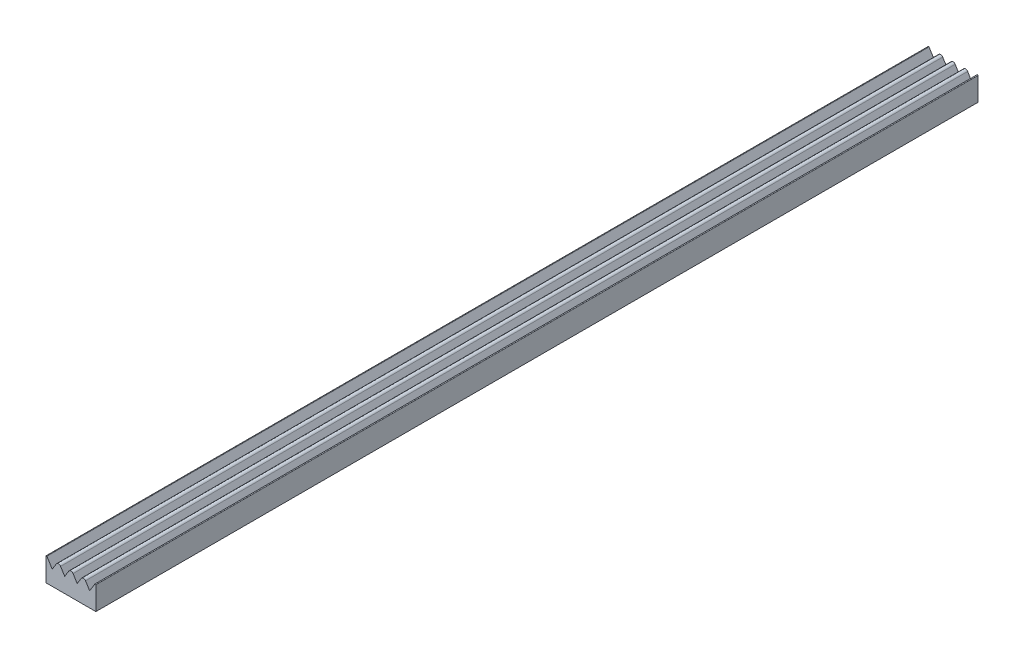
ISO-10303-21;
HEADER;
FILE_DESCRIPTION(('STEP AP214'),'2;1');
FILE_NAME('part.step','',(''),(''),'','','');
FILE_SCHEMA(('AUTOMOTIVE_DESIGN { 1 0 10303 214 1 1 1 1 }'));
ENDSEC;
DATA;
#1=APPLICATION_CONTEXT('core data for automotive mechanical design processes');
#2=APPLICATION_PROTOCOL_DEFINITION('international standard','automotive_design',2000,#1);
#3=PRODUCT_CONTEXT('',#1,'mechanical');
#4=PRODUCT('Part','Part','',(#3));
#5=PRODUCT_RELATED_PRODUCT_CATEGORY('part','',(#4));
#6=PRODUCT_DEFINITION_FORMATION('','',#4);
#7=PRODUCT_DEFINITION_CONTEXT('part definition',#1,'design');
#8=PRODUCT_DEFINITION('design','',#6,#7);
#9=PRODUCT_DEFINITION_SHAPE('','',#8);
#10=(LENGTH_UNIT() NAMED_UNIT(*) SI_UNIT(.MILLI.,.METRE.));
#11=(NAMED_UNIT(*) PLANE_ANGLE_UNIT() SI_UNIT($,.RADIAN.));
#12=(NAMED_UNIT(*) SI_UNIT($,.STERADIAN.) SOLID_ANGLE_UNIT());
#13=UNCERTAINTY_MEASURE_WITH_UNIT(LENGTH_MEASURE(1.E-05),#10,'distance_accuracy_value','');
#14=(GEOMETRIC_REPRESENTATION_CONTEXT(3) GLOBAL_UNCERTAINTY_ASSIGNED_CONTEXT((#13)) GLOBAL_UNIT_ASSIGNED_CONTEXT((#10,
#11,#12)) REPRESENTATION_CONTEXT('',''));
#15=CARTESIAN_POINT('',(0.,0.,0.));
#16=DIRECTION('',(0.,0.,1.));
#17=DIRECTION('',(1.,0.,0.));
#18=AXIS2_PLACEMENT_3D('',#15,#16,#17);
#19=CARTESIAN_POINT('',(0.,0.,224.63125));
#20=DIRECTION('',(-1.,0.,0.));
#21=DIRECTION('',(0.,0.,1.));
#22=AXIS2_PLACEMENT_3D('',#19,#20,#21);
#23=PLANE('',#22);
#24=DIRECTION('',(0.,1.,0.));
#25=VECTOR('',#24,1.);
#26=CARTESIAN_POINT('',(0.,0.,0.));
#27=LINE('',#26,#25);
#28=CARTESIAN_POINT('',(0.,0.,0.));
#29=VERTEX_POINT('',#28);
#30=CARTESIAN_POINT('',(0.,5.90717687924576,0.));
#31=VERTEX_POINT('',#30);
#32=EDGE_CURVE('E177',#29,#31,#27,.T.);
#33=ORIENTED_EDGE('',*,*,#32,.T.);
#34=DIRECTION('',(0.,0.,-1.));
#35=VECTOR('',#34,1.);
#36=CARTESIAN_POINT('',(0.,5.90717687924576,224.63125));
#37=LINE('',#36,#35);
#38=CARTESIAN_POINT('',(0.,5.90717687924576,224.63125));
#39=VERTEX_POINT('',#38);
#40=EDGE_CURVE('E11',#39,#31,#37,.T.);
#41=ORIENTED_EDGE('',*,*,#40,.F.);
#42=DIRECTION('',(0.,1.,0.));
#43=VECTOR('',#42,1.);
#44=CARTESIAN_POINT('',(0.,0.,224.63125));
#45=LINE('',#44,#43);
#46=CARTESIAN_POINT('',(0.,0.,224.63125));
#47=VERTEX_POINT('',#46);
#48=EDGE_CURVE('E207',#47,#39,#45,.T.);
#49=ORIENTED_EDGE('',*,*,#48,.F.);
#50=DIRECTION('',(0.,0.,-1.));
#51=VECTOR('',#50,1.);
#52=CARTESIAN_POINT('',(0.,0.,224.63125));
#53=LINE('',#52,#51);
#54=EDGE_CURVE('E173',#47,#29,#53,.T.);
#55=ORIENTED_EDGE('',*,*,#54,.T.);
#56=EDGE_LOOP('',(#33,#41,#49,#55));
#57=FACE_BOUND('',#56,.T.);
#58=ADVANCED_FACE('F33',(#57),#23,.F.);
#59=CARTESIAN_POINT('',(-0.127,5.90717687924576,224.63125));
#60=DIRECTION('',(0.,0.,-1.));
#61=DIRECTION('',(-1.,0.,0.));
#62=AXIS2_PLACEMENT_3D('',#59,#60,#61);
#63=CYLINDRICAL_SURFACE('',#62,0.127);
#64=CARTESIAN_POINT('',(-0.127,5.90717687924576,0.));
#65=DIRECTION('',(0.,0.,1.));
#66=DIRECTION('',(1.,0.,0.));
#67=AXIS2_PLACEMENT_3D('',#64,#65,#66);
#68=CIRCLE('',#67,0.127);
#69=CARTESIAN_POINT('',(-0.234695784608649,5.97448674462616,0.));
#70=VERTEX_POINT('',#69);
#71=EDGE_CURVE('E180',#31,#70,#68,.T.);
#72=ORIENTED_EDGE('',*,*,#71,.T.);
#73=DIRECTION('',(0.,0.,-1.));
#74=VECTOR('',#73,1.);
#75=CARTESIAN_POINT('',(-0.234695784608649,5.97448674462616,224.63125));
#76=LINE('',#75,#74);
#77=CARTESIAN_POINT('',(-0.234695784608649,5.97448674462616,224.63125));
#78=VERTEX_POINT('',#77);
#79=EDGE_CURVE('E41',#78,#70,#76,.T.);
#80=ORIENTED_EDGE('',*,*,#79,.F.);
#81=CARTESIAN_POINT('',(-0.127,5.90717687924576,224.63125));
#82=DIRECTION('',(0.,0.,1.));
#83=DIRECTION('',(1.,0.,0.));
#84=AXIS2_PLACEMENT_3D('',#81,#82,#83);
#85=CIRCLE('',#84,0.127);
#86=EDGE_CURVE('E116',#39,#78,#85,.T.);
#87=ORIENTED_EDGE('',*,*,#86,.F.);
#88=ORIENTED_EDGE('',*,*,#40,.T.);
#89=EDGE_LOOP('',(#72,#80,#87,#88));
#90=FACE_BOUND('',#89,.T.);
#91=ADVANCED_FACE('F305',(#90),#63,.T.);
#92=CARTESIAN_POINT('',(-1.5875,3.81,224.63125));
#93=DIRECTION('',(0.847998304005088,-0.529998940003179,0.));
#94=DIRECTION('',(0.529998940003179,0.847998304005088,0.));
#95=AXIS2_PLACEMENT_3D('',#92,#93,#94);
#96=PLANE('',#95);
#97=DIRECTION('',(-0.529998940003179,-0.847998304005088,0.));
#98=VECTOR('',#97,1.);
#99=CARTESIAN_POINT('',(-1.5875,3.81,0.));
#100=LINE('',#99,#98);
#101=CARTESIAN_POINT('',(-1.5875,3.81,0.));
#102=VERTEX_POINT('',#101);
#103=EDGE_CURVE('E182',#70,#102,#100,.T.);
#104=ORIENTED_EDGE('',*,*,#103,.T.);
#105=DIRECTION('',(0.,0.,-1.));
#106=VECTOR('',#105,1.);
#107=CARTESIAN_POINT('',(-1.5875,3.81,224.63125));
#108=LINE('',#107,#106);
#109=CARTESIAN_POINT('',(-1.5875,3.81,224.63125));
#110=VERTEX_POINT('',#109);
#111=EDGE_CURVE('E238',#110,#102,#108,.T.);
#112=ORIENTED_EDGE('',*,*,#111,.F.);
#113=DIRECTION('',(-0.529998940003179,-0.847998304005088,0.));
#114=VECTOR('',#113,1.);
#115=CARTESIAN_POINT('',(-1.5875,3.81,224.63125));
#116=LINE('',#115,#114);
#117=EDGE_CURVE('E246',#78,#110,#116,.T.);
#118=ORIENTED_EDGE('',*,*,#117,.F.);
#119=ORIENTED_EDGE('',*,*,#79,.T.);
#120=EDGE_LOOP('',(#104,#112,#118,#119));
#121=FACE_BOUND('',#120,.T.);
#122=ADVANCED_FACE('F244',(#121),#96,.F.);
#123=CARTESIAN_POINT('',(-2.63652107695677,5.48843372313082,224.63125));
#124=DIRECTION('',(-0.847998304005088,-0.52999894000318,0.));
#125=DIRECTION('',(0.52999894000318,-0.847998304005088,0.));
#126=AXIS2_PLACEMENT_3D('',#123,#124,#125);
#127=PLANE('',#126);
#128=DIRECTION('',(-0.52999894000318,0.847998304005088,0.));
#129=VECTOR('',#128,1.);
#130=CARTESIAN_POINT('',(-2.63652107695677,5.48843372313082,0.));
#131=LINE('',#130,#129);
#132=CARTESIAN_POINT('',(-2.63652107695677,5.48843372313082,0.));
#133=VERTEX_POINT('',#132);
#134=EDGE_CURVE('E184',#102,#133,#131,.T.);
#135=ORIENTED_EDGE('',*,*,#134,.T.);
#136=DIRECTION('',(0.,0.,-1.));
#137=VECTOR('',#136,1.);
#138=CARTESIAN_POINT('',(-2.63652107695677,5.48843372313082,224.63125));
#139=LINE('',#138,#137);
#140=CARTESIAN_POINT('',(-2.63652107695677,5.48843372313082,224.63125));
#141=VERTEX_POINT('',#140);
#142=EDGE_CURVE('E235',#141,#133,#139,.T.);
#143=ORIENTED_EDGE('',*,*,#142,.F.);
#144=DIRECTION('',(-0.52999894000318,0.847998304005088,0.));
#145=VECTOR('',#144,1.);
#146=CARTESIAN_POINT('',(-2.63652107695677,5.48843372313082,224.63125));
#147=LINE('',#146,#145);
#148=EDGE_CURVE('E264',#110,#141,#147,.T.);
#149=ORIENTED_EDGE('',*,*,#148,.F.);
#150=ORIENTED_EDGE('',*,*,#111,.T.);
#151=EDGE_LOOP('',(#135,#143,#149,#150));
#152=FACE_BOUND('',#151,.T.);
#153=ADVANCED_FACE('F255',(#152),#127,.F.);
#154=CARTESIAN_POINT('',(-3.175,5.15188439622881,224.63125));
#155=DIRECTION('',(0.,0.,-1.));
#156=DIRECTION('',(-1.,0.,0.));
#157=AXIS2_PLACEMENT_3D('',#154,#155,#156);
#158=CYLINDRICAL_SURFACE('',#157,0.635);
#159=CARTESIAN_POINT('',(-3.175,5.15188439622881,0.));
#160=DIRECTION('',(0.,0.,1.));
#161=DIRECTION('',(-1.,0.,0.));
#162=AXIS2_PLACEMENT_3D('',#159,#160,#161);
#163=CIRCLE('',#162,0.635);
#164=CARTESIAN_POINT('',(-3.71347892304324,5.48843372313082,0.));
#165=VERTEX_POINT('',#164);
#166=EDGE_CURVE('E186',#133,#165,#163,.T.);
#167=ORIENTED_EDGE('',*,*,#166,.T.);
#168=DIRECTION('',(0.,0.,-1.));
#169=VECTOR('',#168,1.);
#170=CARTESIAN_POINT('',(-3.71347892304324,5.48843372313082,224.63125));
#171=LINE('',#170,#169);
#172=CARTESIAN_POINT('',(-3.71347892304324,5.48843372313082,224.63125));
#173=VERTEX_POINT('',#172);
#174=EDGE_CURVE('E232',#173,#165,#171,.T.);
#175=ORIENTED_EDGE('',*,*,#174,.F.);
#176=CARTESIAN_POINT('',(-3.175,5.15188439622881,224.63125));
#177=DIRECTION('',(0.,0.,1.));
#178=DIRECTION('',(-1.,0.,0.));
#179=AXIS2_PLACEMENT_3D('',#176,#177,#178);
#180=CIRCLE('',#179,0.635);
#181=EDGE_CURVE('E261',#141,#173,#180,.T.);
#182=ORIENTED_EDGE('',*,*,#181,.F.);
#183=ORIENTED_EDGE('',*,*,#142,.T.);
#184=EDGE_LOOP('',(#167,#175,#182,#183));
#185=FACE_BOUND('',#184,.T.);
#186=ADVANCED_FACE('F259',(#185),#158,.T.);
#187=CARTESIAN_POINT('',(-4.7625,3.81,224.63125));
#188=DIRECTION('',(0.847998304005088,-0.52999894000318,0.));
#189=DIRECTION('',(0.52999894000318,0.847998304005088,0.));
#190=AXIS2_PLACEMENT_3D('',#187,#188,#189);
#191=PLANE('',#190);
#192=DIRECTION('',(-0.52999894000318,-0.847998304005088,0.));
#193=VECTOR('',#192,1.);
#194=CARTESIAN_POINT('',(-4.7625,3.81,0.));
#195=LINE('',#194,#193);
#196=CARTESIAN_POINT('',(-4.7625,3.81,0.));
#197=VERTEX_POINT('',#196);
#198=EDGE_CURVE('E188',#165,#197,#195,.T.);
#199=ORIENTED_EDGE('',*,*,#198,.T.);
#200=DIRECTION('',(0.,0.,-1.));
#201=VECTOR('',#200,1.);
#202=CARTESIAN_POINT('',(-4.7625,3.81,224.63125));
#203=LINE('',#202,#201);
#204=CARTESIAN_POINT('',(-4.7625,3.81,224.63125));
#205=VERTEX_POINT('',#204);
#206=EDGE_CURVE('E229',#205,#197,#203,.T.);
#207=ORIENTED_EDGE('',*,*,#206,.F.);
#208=DIRECTION('',(-0.52999894000318,-0.847998304005088,0.));
#209=VECTOR('',#208,1.);
#210=CARTESIAN_POINT('',(-4.7625,3.81,224.63125));
#211=LINE('',#210,#209);
#212=EDGE_CURVE('E263',#173,#205,#211,.T.);
#213=ORIENTED_EDGE('',*,*,#212,.F.);
#214=ORIENTED_EDGE('',*,*,#174,.T.);
#215=EDGE_LOOP('',(#199,#207,#213,#214));
#216=FACE_BOUND('',#215,.T.);
#217=ADVANCED_FACE('F318',(#216),#191,.F.);
#218=CARTESIAN_POINT('',(-4.7625,3.81,224.63125));
#219=DIRECTION('',(-0.847998304005088,-0.52999894000318,0.));
#220=DIRECTION('',(0.52999894000318,-0.847998304005088,0.));
#221=AXIS2_PLACEMENT_3D('',#218,#219,#220);
#222=PLANE('',#221);
#223=DIRECTION('',(-0.52999894000318,0.847998304005088,0.));
#224=VECTOR('',#223,1.);
#225=CARTESIAN_POINT('',(-4.7625,3.81,0.));
#226=LINE('',#225,#224);
#227=CARTESIAN_POINT('',(-5.81152107695676,5.48843372313082,0.));
#228=VERTEX_POINT('',#227);
#229=EDGE_CURVE('E190',#197,#228,#226,.T.);
#230=ORIENTED_EDGE('',*,*,#229,.T.);
#231=DIRECTION('',(0.,0.,-1.));
#232=VECTOR('',#231,1.);
#233=CARTESIAN_POINT('',(-5.81152107695676,5.48843372313082,224.63125));
#234=LINE('',#233,#232);
#235=CARTESIAN_POINT('',(-5.81152107695676,5.48843372313082,224.63125));
#236=VERTEX_POINT('',#235);
#237=EDGE_CURVE('E226',#236,#228,#234,.T.);
#238=ORIENTED_EDGE('',*,*,#237,.F.);
#239=DIRECTION('',(-0.52999894000318,0.847998304005088,0.));
#240=VECTOR('',#239,1.);
#241=CARTESIAN_POINT('',(-4.7625,3.81,224.63125));
#242=LINE('',#241,#240);
#243=EDGE_CURVE('E266',#205,#236,#242,.T.);
#244=ORIENTED_EDGE('',*,*,#243,.F.);
#245=ORIENTED_EDGE('',*,*,#206,.T.);
#246=EDGE_LOOP('',(#230,#238,#244,#245));
#247=FACE_BOUND('',#246,.T.);
#248=ADVANCED_FACE('F321',(#247),#222,.F.);
#249=CARTESIAN_POINT('',(-6.35,5.15188439622881,224.63125));
#250=DIRECTION('',(0.,0.,-1.));
#251=DIRECTION('',(-1.,0.,0.));
#252=AXIS2_PLACEMENT_3D('',#249,#250,#251);
#253=CYLINDRICAL_SURFACE('',#252,0.635);
#254=CARTESIAN_POINT('',(-6.35,5.15188439622881,0.));
#255=DIRECTION('',(0.,0.,1.));
#256=DIRECTION('',(-1.,0.,0.));
#257=AXIS2_PLACEMENT_3D('',#254,#255,#256);
#258=CIRCLE('',#257,0.635);
#259=CARTESIAN_POINT('',(-6.88847892304323,5.48843372313082,0.));
#260=VERTEX_POINT('',#259);
#261=EDGE_CURVE('E192',#228,#260,#258,.T.);
#262=ORIENTED_EDGE('',*,*,#261,.T.);
#263=DIRECTION('',(0.,0.,-1.));
#264=VECTOR('',#263,1.);
#265=CARTESIAN_POINT('',(-6.88847892304323,5.48843372313082,224.63125));
#266=LINE('',#265,#264);
#267=CARTESIAN_POINT('',(-6.88847892304323,5.48843372313082,224.63125));
#268=VERTEX_POINT('',#267);
#269=EDGE_CURVE('E223',#268,#260,#266,.T.);
#270=ORIENTED_EDGE('',*,*,#269,.F.);
#271=CARTESIAN_POINT('',(-6.35,5.15188439622881,224.63125));
#272=DIRECTION('',(0.,0.,1.));
#273=DIRECTION('',(-1.,0.,0.));
#274=AXIS2_PLACEMENT_3D('',#271,#272,#273);
#275=CIRCLE('',#274,0.635);
#276=EDGE_CURVE('E272',#236,#268,#275,.T.);
#277=ORIENTED_EDGE('',*,*,#276,.F.);
#278=ORIENTED_EDGE('',*,*,#237,.T.);
#279=EDGE_LOOP('',(#262,#270,#277,#278));
#280=FACE_BOUND('',#279,.T.);
#281=ADVANCED_FACE('F325',(#280),#253,.T.);
#282=CARTESIAN_POINT('',(-7.9375,3.81,224.63125));
#283=DIRECTION('',(0.847998304005088,-0.52999894000318,0.));
#284=DIRECTION('',(0.52999894000318,0.847998304005088,0.));
#285=AXIS2_PLACEMENT_3D('',#282,#283,#284);
#286=PLANE('',#285);
#287=DIRECTION('',(-0.52999894000318,-0.847998304005088,0.));
#288=VECTOR('',#287,1.);
#289=CARTESIAN_POINT('',(-7.9375,3.81,0.));
#290=LINE('',#289,#288);
#291=CARTESIAN_POINT('',(-7.9375,3.81,0.));
#292=VERTEX_POINT('',#291);
#293=EDGE_CURVE('E194',#260,#292,#290,.T.);
#294=ORIENTED_EDGE('',*,*,#293,.T.);
#295=DIRECTION('',(0.,0.,-1.));
#296=VECTOR('',#295,1.);
#297=CARTESIAN_POINT('',(-7.9375,3.81,224.63125));
#298=LINE('',#297,#296);
#299=CARTESIAN_POINT('',(-7.9375,3.81,224.63125));
#300=VERTEX_POINT('',#299);
#301=EDGE_CURVE('E220',#300,#292,#298,.T.);
#302=ORIENTED_EDGE('',*,*,#301,.F.);
#303=DIRECTION('',(-0.52999894000318,-0.847998304005088,0.));
#304=VECTOR('',#303,1.);
#305=CARTESIAN_POINT('',(-7.9375,3.81,224.63125));
#306=LINE('',#305,#304);
#307=EDGE_CURVE('E274',#268,#300,#306,.T.);
#308=ORIENTED_EDGE('',*,*,#307,.F.);
#309=ORIENTED_EDGE('',*,*,#269,.T.);
#310=EDGE_LOOP('',(#294,#302,#308,#309));
#311=FACE_BOUND('',#310,.T.);
#312=ADVANCED_FACE('F329',(#311),#286,.F.);
#313=CARTESIAN_POINT('',(-7.9375,3.81,224.63125));
#314=DIRECTION('',(-0.847998304005088,-0.52999894000318,0.));
#315=DIRECTION('',(0.52999894000318,-0.847998304005088,0.));
#316=AXIS2_PLACEMENT_3D('',#313,#314,#315);
#317=PLANE('',#316);
#318=DIRECTION('',(-0.52999894000318,0.847998304005088,0.));
#319=VECTOR('',#318,1.);
#320=CARTESIAN_POINT('',(-7.9375,3.81,0.));
#321=LINE('',#320,#319);
#322=CARTESIAN_POINT('',(-8.98652107695676,5.48843372313082,0.));
#323=VERTEX_POINT('',#322);
#324=EDGE_CURVE('E196',#292,#323,#321,.T.);
#325=ORIENTED_EDGE('',*,*,#324,.T.);
#326=DIRECTION('',(0.,0.,-1.));
#327=VECTOR('',#326,1.);
#328=CARTESIAN_POINT('',(-8.98652107695676,5.48843372313082,224.63125));
#329=LINE('',#328,#327);
#330=CARTESIAN_POINT('',(-8.98652107695676,5.48843372313082,224.63125));
#331=VERTEX_POINT('',#330);
#332=EDGE_CURVE('E217',#331,#323,#329,.T.);
#333=ORIENTED_EDGE('',*,*,#332,.F.);
#334=DIRECTION('',(-0.52999894000318,0.847998304005088,0.));
#335=VECTOR('',#334,1.);
#336=CARTESIAN_POINT('',(-7.9375,3.81,224.63125));
#337=LINE('',#336,#335);
#338=EDGE_CURVE('E276',#300,#331,#337,.T.);
#339=ORIENTED_EDGE('',*,*,#338,.F.);
#340=ORIENTED_EDGE('',*,*,#301,.T.);
#341=EDGE_LOOP('',(#325,#333,#339,#340));
#342=FACE_BOUND('',#341,.T.);
#343=ADVANCED_FACE('F333',(#342),#317,.F.);
#344=CARTESIAN_POINT('',(-9.525,5.15188439622881,224.63125));
#345=DIRECTION('',(0.,0.,-1.));
#346=DIRECTION('',(-1.,0.,0.));
#347=AXIS2_PLACEMENT_3D('',#344,#345,#346);
#348=CYLINDRICAL_SURFACE('',#347,0.635);
#349=CARTESIAN_POINT('',(-9.525,5.15188439622881,0.));
#350=DIRECTION('',(0.,0.,1.));
#351=DIRECTION('',(1.,0.,0.));
#352=AXIS2_PLACEMENT_3D('',#349,#350,#351);
#353=CIRCLE('',#352,0.635);
#354=CARTESIAN_POINT('',(-10.0634789230432,5.48843372313082,0.));
#355=VERTEX_POINT('',#354);
#356=EDGE_CURVE('E198',#323,#355,#353,.T.);
#357=ORIENTED_EDGE('',*,*,#356,.T.);
#358=DIRECTION('',(0.,0.,-1.));
#359=VECTOR('',#358,1.);
#360=CARTESIAN_POINT('',(-10.0634789230432,5.48843372313082,224.63125));
#361=LINE('',#360,#359);
#362=CARTESIAN_POINT('',(-10.0634789230432,5.48843372313082,224.63125));
#363=VERTEX_POINT('',#362);
#364=EDGE_CURVE('E214',#363,#355,#361,.T.);
#365=ORIENTED_EDGE('',*,*,#364,.F.);
#366=CARTESIAN_POINT('',(-9.525,5.15188439622881,224.63125));
#367=DIRECTION('',(0.,0.,1.));
#368=DIRECTION('',(1.,0.,0.));
#369=AXIS2_PLACEMENT_3D('',#366,#367,#368);
#370=CIRCLE('',#369,0.635);
#371=EDGE_CURVE('E278',#331,#363,#370,.T.);
#372=ORIENTED_EDGE('',*,*,#371,.F.);
#373=ORIENTED_EDGE('',*,*,#332,.T.);
#374=EDGE_LOOP('',(#357,#365,#372,#373));
#375=FACE_BOUND('',#374,.T.);
#376=ADVANCED_FACE('F337',(#375),#348,.T.);
#377=CARTESIAN_POINT('',(-10.0634789230432,5.48843372313082,224.63125));
#378=DIRECTION('',(0.847998304005088,-0.52999894000318,0.));
#379=DIRECTION('',(0.52999894000318,0.847998304005088,0.));
#380=AXIS2_PLACEMENT_3D('',#377,#378,#379);
#381=PLANE('',#380);
#382=DIRECTION('',(-0.52999894000318,-0.847998304005088,0.));
#383=VECTOR('',#382,1.);
#384=CARTESIAN_POINT('',(-10.0634789230432,5.48843372313082,0.));
#385=LINE('',#384,#383);
#386=CARTESIAN_POINT('',(-11.1125,3.81,0.));
#387=VERTEX_POINT('',#386);
#388=EDGE_CURVE('E200',#355,#387,#385,.T.);
#389=ORIENTED_EDGE('',*,*,#388,.T.);
#390=DIRECTION('',(0.,0.,-1.));
#391=VECTOR('',#390,1.);
#392=CARTESIAN_POINT('',(-11.1125,3.81,224.63125));
#393=LINE('',#392,#391);
#394=CARTESIAN_POINT('',(-11.1125,3.81,224.63125));
#395=VERTEX_POINT('',#394);
#396=EDGE_CURVE('E211',#395,#387,#393,.T.);
#397=ORIENTED_EDGE('',*,*,#396,.F.);
#398=DIRECTION('',(-0.52999894000318,-0.847998304005088,0.));
#399=VECTOR('',#398,1.);
#400=CARTESIAN_POINT('',(-10.0634789230432,5.48843372313082,224.63125));
#401=LINE('',#400,#399);
#402=EDGE_CURVE('E280',#363,#395,#401,.T.);
#403=ORIENTED_EDGE('',*,*,#402,.F.);
#404=ORIENTED_EDGE('',*,*,#364,.T.);
#405=EDGE_LOOP('',(#389,#397,#403,#404));
#406=FACE_BOUND('',#405,.T.);
#407=ADVANCED_FACE('F286',(#406),#381,.F.);
#408=CARTESIAN_POINT('',(-11.1125,3.81,224.63125));
#409=DIRECTION('',(-0.847998304005088,-0.52999894000318,0.));
#410=DIRECTION('',(0.52999894000318,-0.847998304005088,0.));
#411=AXIS2_PLACEMENT_3D('',#408,#409,#410);
#412=PLANE('',#411);
#413=DIRECTION('',(-0.52999894000318,0.847998304005088,0.));
#414=VECTOR('',#413,1.);
#415=CARTESIAN_POINT('',(-11.1125,3.81,0.));
#416=LINE('',#415,#414);
#417=CARTESIAN_POINT('',(-12.4653042153914,5.97448674462616,0.));
#418=VERTEX_POINT('',#417);
#419=EDGE_CURVE('E202',#387,#418,#416,.T.);
#420=ORIENTED_EDGE('',*,*,#419,.T.);
#421=DIRECTION('',(0.,0.,-1.));
#422=VECTOR('',#421,1.);
#423=CARTESIAN_POINT('',(-12.4653042153914,5.97448674462616,224.63125));
#424=LINE('',#423,#422);
#425=CARTESIAN_POINT('',(-12.4653042153914,5.97448674462616,224.63125));
#426=VERTEX_POINT('',#425);
#427=EDGE_CURVE('E168',#426,#418,#424,.T.);
#428=ORIENTED_EDGE('',*,*,#427,.F.);
#429=DIRECTION('',(-0.52999894000318,0.847998304005088,0.));
#430=VECTOR('',#429,1.);
#431=CARTESIAN_POINT('',(-11.1125,3.81,224.63125));
#432=LINE('',#431,#430);
#433=EDGE_CURVE('E159',#395,#426,#432,.T.);
#434=ORIENTED_EDGE('',*,*,#433,.F.);
#435=ORIENTED_EDGE('',*,*,#396,.T.);
#436=EDGE_LOOP('',(#420,#428,#434,#435));
#437=FACE_BOUND('',#436,.T.);
#438=ADVANCED_FACE('F290',(#437),#412,.F.);
#439=CARTESIAN_POINT('',(-12.573,5.90717687924576,224.63125));
#440=DIRECTION('',(0.,0.,-1.));
#441=DIRECTION('',(-1.,0.,0.));
#442=AXIS2_PLACEMENT_3D('',#439,#440,#441);
#443=CYLINDRICAL_SURFACE('',#442,0.127);
#444=CARTESIAN_POINT('',(-12.573,5.90717687924576,0.));
#445=DIRECTION('',(0.,0.,1.));
#446=DIRECTION('',(1.,0.,0.));
#447=AXIS2_PLACEMENT_3D('',#444,#445,#446);
#448=CIRCLE('',#447,0.127);
#449=CARTESIAN_POINT('',(-12.7,5.90717687924575,0.));
#450=VERTEX_POINT('',#449);
#451=EDGE_CURVE('E167',#418,#450,#448,.T.);
#452=ORIENTED_EDGE('',*,*,#451,.T.);
#453=DIRECTION('',(0.,0.,-1.));
#454=VECTOR('',#453,1.);
#455=CARTESIAN_POINT('',(-12.7,5.90717687924575,224.63125));
#456=LINE('',#455,#454);
#457=CARTESIAN_POINT('',(-12.7,5.90717687924575,224.63125));
#458=VERTEX_POINT('',#457);
#459=EDGE_CURVE('E164',#458,#450,#456,.T.);
#460=ORIENTED_EDGE('',*,*,#459,.F.);
#461=CARTESIAN_POINT('',(-12.573,5.90717687924576,224.63125));
#462=DIRECTION('',(0.,0.,1.));
#463=DIRECTION('',(1.,0.,0.));
#464=AXIS2_PLACEMENT_3D('',#461,#462,#463);
#465=CIRCLE('',#464,0.127);
#466=EDGE_CURVE('E153',#426,#458,#465,.T.);
#467=ORIENTED_EDGE('',*,*,#466,.F.);
#468=ORIENTED_EDGE('',*,*,#427,.T.);
#469=EDGE_LOOP('',(#452,#460,#467,#468));
#470=FACE_BOUND('',#469,.T.);
#471=ADVANCED_FACE('F165',(#470),#443,.T.);
#472=CARTESIAN_POINT('',(-12.7,0.,224.63125));
#473=DIRECTION('',(1.,0.,0.));
#474=DIRECTION('',(0.,0.,-1.));
#475=AXIS2_PLACEMENT_3D('',#472,#473,#474);
#476=PLANE('',#475);
#477=DIRECTION('',(0.,-1.,0.));
#478=VECTOR('',#477,1.);
#479=CARTESIAN_POINT('',(-12.7,0.,0.));
#480=LINE('',#479,#478);
#481=CARTESIAN_POINT('',(-12.7,0.,0.));
#482=VERTEX_POINT('',#481);
#483=EDGE_CURVE('E102',#450,#482,#480,.T.);
#484=ORIENTED_EDGE('',*,*,#483,.T.);
#485=DIRECTION('',(0.,0.,-1.));
#486=VECTOR('',#485,1.);
#487=CARTESIAN_POINT('',(-12.7,0.,224.63125));
#488=LINE('',#487,#486);
#489=CARTESIAN_POINT('',(-12.7,0.,224.63125));
#490=VERTEX_POINT('',#489);
#491=EDGE_CURVE('E169',#490,#482,#488,.T.);
#492=ORIENTED_EDGE('',*,*,#491,.F.);
#493=DIRECTION('',(0.,-1.,0.));
#494=VECTOR('',#493,1.);
#495=CARTESIAN_POINT('',(-12.7,0.,224.63125));
#496=LINE('',#495,#494);
#497=EDGE_CURVE('E157',#458,#490,#496,.T.);
#498=ORIENTED_EDGE('',*,*,#497,.F.);
#499=ORIENTED_EDGE('',*,*,#459,.T.);
#500=EDGE_LOOP('',(#484,#492,#498,#499));
#501=FACE_BOUND('',#500,.T.);
#502=ADVANCED_FACE('F171',(#501),#476,.F.);
#503=CARTESIAN_POINT('',(0.,0.,224.63125));
#504=DIRECTION('',(0.,1.,0.));
#505=DIRECTION('',(-1.,0.,0.));
#506=AXIS2_PLACEMENT_3D('',#503,#504,#505);
#507=PLANE('',#506);
#508=DIRECTION('',(1.,0.,0.));
#509=VECTOR('',#508,1.);
#510=CARTESIAN_POINT('',(0.,0.,0.));
#511=LINE('',#510,#509);
#512=EDGE_CURVE('E108',#482,#29,#511,.T.);
#513=ORIENTED_EDGE('',*,*,#512,.T.);
#514=ORIENTED_EDGE('',*,*,#54,.F.);
#515=DIRECTION('',(1.,0.,0.));
#516=VECTOR('',#515,1.);
#517=CARTESIAN_POINT('',(0.,0.,224.63125));
#518=LINE('',#517,#516);
#519=EDGE_CURVE('E49',#490,#47,#518,.T.);
#520=ORIENTED_EDGE('',*,*,#519,.F.);
#521=ORIENTED_EDGE('',*,*,#491,.T.);
#522=EDGE_LOOP('',(#513,#514,#520,#521));
#523=FACE_BOUND('',#522,.T.);
#524=ADVANCED_FACE('F294',(#523),#507,.F.);
#525=CARTESIAN_POINT('',(-0.127,5.90717687924576,224.63125));
#526=DIRECTION('',(0.,0.,1.));
#527=DIRECTION('',(1.,0.,0.));
#528=AXIS2_PLACEMENT_3D('',#525,#526,#527);
#529=PLANE('',#528);
#530=ORIENTED_EDGE('',*,*,#48,.T.);
#531=ORIENTED_EDGE('',*,*,#86,.T.);
#532=ORIENTED_EDGE('',*,*,#117,.T.);
#533=ORIENTED_EDGE('',*,*,#148,.T.);
#534=ORIENTED_EDGE('',*,*,#181,.T.);
#535=ORIENTED_EDGE('',*,*,#212,.T.);
#536=ORIENTED_EDGE('',*,*,#243,.T.);
#537=ORIENTED_EDGE('',*,*,#276,.T.);
#538=ORIENTED_EDGE('',*,*,#307,.T.);
#539=ORIENTED_EDGE('',*,*,#338,.T.);
#540=ORIENTED_EDGE('',*,*,#371,.T.);
#541=ORIENTED_EDGE('',*,*,#402,.T.);
#542=ORIENTED_EDGE('',*,*,#433,.T.);
#543=ORIENTED_EDGE('',*,*,#466,.T.);
#544=ORIENTED_EDGE('',*,*,#497,.T.);
#545=ORIENTED_EDGE('',*,*,#519,.T.);
#546=EDGE_LOOP('',(#530,#531,#532,#533,#534,#535,#536,#537,#538,#539,#540,#541,#542,#543,#544,#545));
#547=FACE_BOUND('',#546,.T.);
#548=ADVANCED_FACE('F155',(#547),#529,.T.);
#549=CARTESIAN_POINT('',(-0.127,5.90717687924576,0.));
#550=DIRECTION('',(0.,0.,1.));
#551=DIRECTION('',(1.,0.,0.));
#552=AXIS2_PLACEMENT_3D('',#549,#550,#551);
#553=PLANE('',#552);
#554=ORIENTED_EDGE('',*,*,#32,.F.);
#555=ORIENTED_EDGE('',*,*,#512,.F.);
#556=ORIENTED_EDGE('',*,*,#483,.F.);
#557=ORIENTED_EDGE('',*,*,#451,.F.);
#558=ORIENTED_EDGE('',*,*,#419,.F.);
#559=ORIENTED_EDGE('',*,*,#388,.F.);
#560=ORIENTED_EDGE('',*,*,#356,.F.);
#561=ORIENTED_EDGE('',*,*,#324,.F.);
#562=ORIENTED_EDGE('',*,*,#293,.F.);
#563=ORIENTED_EDGE('',*,*,#261,.F.);
#564=ORIENTED_EDGE('',*,*,#229,.F.);
#565=ORIENTED_EDGE('',*,*,#198,.F.);
#566=ORIENTED_EDGE('',*,*,#166,.F.);
#567=ORIENTED_EDGE('',*,*,#134,.F.);
#568=ORIENTED_EDGE('',*,*,#103,.F.);
#569=ORIENTED_EDGE('',*,*,#71,.F.);
#570=EDGE_LOOP('',(#554,#555,#556,#557,#558,#559,#560,#561,#562,#563,#564,#565,#566,#567,#568,#569));
#571=FACE_BOUND('',#570,.T.);
#572=ADVANCED_FACE('F250',(#571),#553,.F.);
#573=CLOSED_SHELL('',(#58,#91,#122,#153,#186,#217,#248,#281,#312,#343,#376,#407,#438,#471,#502,
#524,#548,#572));
#574=MANIFOLD_SOLID_BREP('B2',#573);
#575=ADVANCED_BREP_SHAPE_REPRESENTATION('',(#18,#574),#14);
#576=SHAPE_DEFINITION_REPRESENTATION(#9,#575);
ENDSEC;
END-ISO-10303-21;
